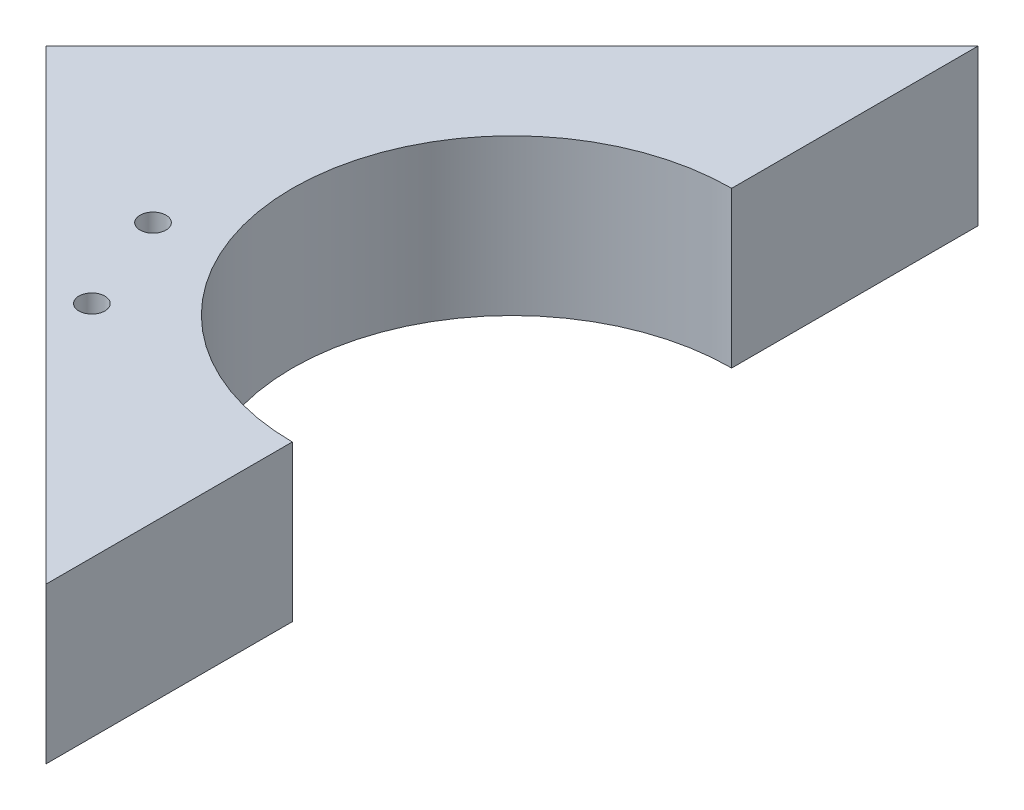
ISO-10303-21;
HEADER;
FILE_DESCRIPTION(('STEP AP214'),'2;1');
FILE_NAME('part.step','',(''),(''),'','','');
FILE_SCHEMA(('AUTOMOTIVE_DESIGN { 1 0 10303 214 1 1 1 1 }'));
ENDSEC;
DATA;
#1=APPLICATION_CONTEXT('core data for automotive mechanical design processes');
#2=APPLICATION_PROTOCOL_DEFINITION('international standard','automotive_design',2000,#1);
#3=PRODUCT_CONTEXT('',#1,'mechanical');
#4=PRODUCT('Part','Part','',(#3));
#5=PRODUCT_RELATED_PRODUCT_CATEGORY('part','',(#4));
#6=PRODUCT_DEFINITION_FORMATION('','',#4);
#7=PRODUCT_DEFINITION_CONTEXT('part definition',#1,'design');
#8=PRODUCT_DEFINITION('design','',#6,#7);
#9=PRODUCT_DEFINITION_SHAPE('','',#8);
#10=(LENGTH_UNIT() NAMED_UNIT(*) SI_UNIT(.MILLI.,.METRE.));
#11=(NAMED_UNIT(*) PLANE_ANGLE_UNIT() SI_UNIT($,.RADIAN.));
#12=(NAMED_UNIT(*) SI_UNIT($,.STERADIAN.) SOLID_ANGLE_UNIT());
#13=UNCERTAINTY_MEASURE_WITH_UNIT(LENGTH_MEASURE(1.E-05),#10,'distance_accuracy_value','');
#14=(GEOMETRIC_REPRESENTATION_CONTEXT(3) GLOBAL_UNCERTAINTY_ASSIGNED_CONTEXT((#13)) GLOBAL_UNIT_ASSIGNED_CONTEXT((#10,
#11,#12)) REPRESENTATION_CONTEXT('',''));
#15=CARTESIAN_POINT('',(0.,0.,0.));
#16=DIRECTION('',(0.,0.,1.));
#17=DIRECTION('',(1.,0.,0.));
#18=AXIS2_PLACEMENT_3D('',#15,#16,#17);
#19=CARTESIAN_POINT('',(0.,36.,-107.76307345283));
#20=DIRECTION('',(0.,1.,0.));
#21=DIRECTION('',(0.,0.,1.));
#22=AXIS2_PLACEMENT_3D('',#19,#20,#21);
#23=PLANE('',#22);
#24=CARTESIAN_POINT('',(-60.0333657227379,36.,-84.782103064267));
#25=DIRECTION('',(0.,1.,0.));
#26=DIRECTION('',(0.,0.,1.));
#27=AXIS2_PLACEMENT_3D('',#24,#25,#26);
#28=CIRCLE('',#27,3.);
#29=CARTESIAN_POINT('',(-60.0333657227379,36.,-81.782103064267));
#30=VERTEX_POINT('',#29);
#31=EDGE_CURVE('E112',#30,#30,#28,.T.);
#32=ORIENTED_EDGE('',*,*,#31,.F.);
#33=EDGE_LOOP('',(#32));
#34=FACE_BOUND('',#33,.T.);
#35=DIRECTION('',(0.,0.,-1.));
#36=VECTOR('',#35,1.);
#37=CARTESIAN_POINT('',(0.,36.,-56.9630734528298));
#38=LINE('',#37,#36);
#39=CARTESIAN_POINT('',(0.,36.,0.));
#40=VERTEX_POINT('',#39);
#41=CARTESIAN_POINT('',(0.,36.,-56.9630734528298));
#42=VERTEX_POINT('',#41);
#43=EDGE_CURVE('E117',#40,#42,#38,.T.);
#44=ORIENTED_EDGE('',*,*,#43,.T.);
#45=CARTESIAN_POINT('',(0.,36.,-107.76307345283));
#46=DIRECTION('',(0.,-1.,0.));
#47=DIRECTION('',(0.,0.,1.));
#48=AXIS2_PLACEMENT_3D('',#45,#46,#47);
#49=CIRCLE('',#48,50.8);
#50=CARTESIAN_POINT('',(0.,36.,-158.56307345283));
#51=VERTEX_POINT('',#50);
#52=EDGE_CURVE('E84',#42,#51,#49,.T.);
#53=ORIENTED_EDGE('',*,*,#52,.T.);
#54=DIRECTION('',(0.,0.,-1.));
#55=VECTOR('',#54,1.);
#56=CARTESIAN_POINT('',(0.,36.,-215.52614690566));
#57=LINE('',#56,#55);
#58=CARTESIAN_POINT('',(0.,36.,-215.52614690566));
#59=VERTEX_POINT('',#58);
#60=EDGE_CURVE('E88',#51,#59,#57,.T.);
#61=ORIENTED_EDGE('',*,*,#60,.T.);
#62=DIRECTION('',(-0.707106781186548,0.,0.707106781186548));
#63=VECTOR('',#62,1.);
#64=CARTESIAN_POINT('',(-107.76307345283,36.,-107.76307345283));
#65=LINE('',#64,#63);
#66=CARTESIAN_POINT('',(-107.76307345283,36.,-107.76307345283));
#67=VERTEX_POINT('',#66);
#68=EDGE_CURVE('E92',#59,#67,#65,.T.);
#69=ORIENTED_EDGE('',*,*,#68,.T.);
#70=DIRECTION('',(0.707106781186547,0.,0.707106781186548));
#71=VECTOR('',#70,1.);
#72=CARTESIAN_POINT('',(0.,36.,0.));
#73=LINE('',#72,#71);
#74=EDGE_CURVE('E50',#67,#40,#73,.T.);
#75=ORIENTED_EDGE('',*,*,#74,.T.);
#76=EDGE_LOOP('',(#44,#53,#61,#69,#75));
#77=FACE_BOUND('',#76,.T.);
#78=CARTESIAN_POINT('',(-50.9025817885837,36.,-61.5091835063819));
#79=DIRECTION('',(0.,1.,0.));
#80=DIRECTION('',(0.,0.,1.));
#81=AXIS2_PLACEMENT_3D('',#78,#79,#80);
#82=CIRCLE('',#81,3.);
#83=CARTESIAN_POINT('',(-50.9025817885837,36.,-58.5091835063819));
#84=VERTEX_POINT('',#83);
#85=EDGE_CURVE('E155',#84,#84,#82,.T.);
#86=ORIENTED_EDGE('',*,*,#85,.F.);
#87=EDGE_LOOP('',(#86));
#88=FACE_BOUND('',#87,.T.);
#89=ADVANCED_FACE('F33',(#34,#77,#88),#23,.T.);
#90=CARTESIAN_POINT('',(0.,0.,-107.76307345283));
#91=DIRECTION('',(0.,1.,0.));
#92=DIRECTION('',(0.,0.,1.));
#93=AXIS2_PLACEMENT_3D('',#90,#91,#92);
#94=PLANE('',#93);
#95=CARTESIAN_POINT('',(-60.0333657227379,0.,-84.782103064267));
#96=DIRECTION('',(0.,1.,0.));
#97=DIRECTION('',(0.,0.,1.));
#98=AXIS2_PLACEMENT_3D('',#95,#96,#97);
#99=CIRCLE('',#98,3.);
#100=CARTESIAN_POINT('',(-60.0333657227379,0.,-81.782103064267));
#101=VERTEX_POINT('',#100);
#102=EDGE_CURVE('E160',#101,#101,#99,.T.);
#103=ORIENTED_EDGE('',*,*,#102,.T.);
#104=EDGE_LOOP('',(#103));
#105=FACE_BOUND('',#104,.T.);
#106=DIRECTION('',(0.,0.,-1.));
#107=VECTOR('',#106,1.);
#108=CARTESIAN_POINT('',(0.,0.,-56.9630734528298));
#109=LINE('',#108,#107);
#110=CARTESIAN_POINT('',(0.,0.,0.));
#111=VERTEX_POINT('',#110);
#112=CARTESIAN_POINT('',(0.,0.,-56.9630734528298));
#113=VERTEX_POINT('',#112);
#114=EDGE_CURVE('E108',#111,#113,#109,.T.);
#115=ORIENTED_EDGE('',*,*,#114,.F.);
#116=DIRECTION('',(0.707106781186547,0.,0.707106781186548));
#117=VECTOR('',#116,1.);
#118=CARTESIAN_POINT('',(0.,0.,0.));
#119=LINE('',#118,#117);
#120=CARTESIAN_POINT('',(-107.76307345283,0.,-107.76307345283));
#121=VERTEX_POINT('',#120);
#122=EDGE_CURVE('E76',#121,#111,#119,.T.);
#123=ORIENTED_EDGE('',*,*,#122,.F.);
#124=DIRECTION('',(-0.707106781186548,0.,0.707106781186548));
#125=VECTOR('',#124,1.);
#126=CARTESIAN_POINT('',(-107.76307345283,0.,-107.76307345283));
#127=LINE('',#126,#125);
#128=CARTESIAN_POINT('',(0.,0.,-215.52614690566));
#129=VERTEX_POINT('',#128);
#130=EDGE_CURVE('E70',#129,#121,#127,.T.);
#131=ORIENTED_EDGE('',*,*,#130,.F.);
#132=DIRECTION('',(0.,0.,-1.));
#133=VECTOR('',#132,1.);
#134=CARTESIAN_POINT('',(0.,0.,-215.52614690566));
#135=LINE('',#134,#133);
#136=CARTESIAN_POINT('',(0.,0.,-158.56307345283));
#137=VERTEX_POINT('',#136);
#138=EDGE_CURVE('E99',#137,#129,#135,.T.);
#139=ORIENTED_EDGE('',*,*,#138,.F.);
#140=CARTESIAN_POINT('',(0.,0.,-107.76307345283));
#141=DIRECTION('',(0.,-1.,0.));
#142=DIRECTION('',(0.,0.,1.));
#143=AXIS2_PLACEMENT_3D('',#140,#141,#142);
#144=CIRCLE('',#143,50.8);
#145=EDGE_CURVE('E111',#113,#137,#144,.T.);
#146=ORIENTED_EDGE('',*,*,#145,.F.);
#147=EDGE_LOOP('',(#115,#123,#131,#139,#146));
#148=FACE_BOUND('',#147,.T.);
#149=CARTESIAN_POINT('',(-50.9025817885837,0.,-61.5091835063819));
#150=DIRECTION('',(0.,1.,0.));
#151=DIRECTION('',(0.,0.,1.));
#152=AXIS2_PLACEMENT_3D('',#149,#150,#151);
#153=CIRCLE('',#152,3.);
#154=CARTESIAN_POINT('',(-50.9025817885837,0.,-58.5091835063819));
#155=VERTEX_POINT('',#154);
#156=EDGE_CURVE('E158',#155,#155,#153,.T.);
#157=ORIENTED_EDGE('',*,*,#156,.T.);
#158=EDGE_LOOP('',(#157));
#159=FACE_BOUND('',#158,.T.);
#160=ADVANCED_FACE('F121',(#105,#148,#159),#94,.F.);
#161=CARTESIAN_POINT('',(0.,36.,-56.9630734528298));
#162=DIRECTION('',(-1.,0.,0.));
#163=DIRECTION('',(0.,0.,1.));
#164=AXIS2_PLACEMENT_3D('',#161,#162,#163);
#165=PLANE('',#164);
#166=ORIENTED_EDGE('',*,*,#114,.T.);
#167=DIRECTION('',(0.,-1.,0.));
#168=VECTOR('',#167,1.);
#169=CARTESIAN_POINT('',(0.,36.,-56.9630734528298));
#170=LINE('',#169,#168);
#171=EDGE_CURVE('E11',#42,#113,#170,.T.);
#172=ORIENTED_EDGE('',*,*,#171,.F.);
#173=ORIENTED_EDGE('',*,*,#43,.F.);
#174=DIRECTION('',(0.,-1.,0.));
#175=VECTOR('',#174,1.);
#176=CARTESIAN_POINT('',(0.,36.,0.));
#177=LINE('',#176,#175);
#178=EDGE_CURVE('E104',#40,#111,#177,.T.);
#179=ORIENTED_EDGE('',*,*,#178,.T.);
#180=EDGE_LOOP('',(#166,#172,#173,#179));
#181=FACE_BOUND('',#180,.T.);
#182=ADVANCED_FACE('F35',(#181),#165,.F.);
#183=CARTESIAN_POINT('',(0.,36.,-107.76307345283));
#184=DIRECTION('',(0.,-1.,0.));
#185=DIRECTION('',(0.,0.,-1.));
#186=AXIS2_PLACEMENT_3D('',#183,#184,#185);
#187=CYLINDRICAL_SURFACE('',#186,50.8);
#188=ORIENTED_EDGE('',*,*,#145,.T.);
#189=DIRECTION('',(0.,-1.,0.));
#190=VECTOR('',#189,1.);
#191=CARTESIAN_POINT('',(0.,36.,-158.56307345283));
#192=LINE('',#191,#190);
#193=EDGE_CURVE('E42',#51,#137,#192,.T.);
#194=ORIENTED_EDGE('',*,*,#193,.F.);
#195=ORIENTED_EDGE('',*,*,#52,.F.);
#196=ORIENTED_EDGE('',*,*,#171,.T.);
#197=EDGE_LOOP('',(#188,#194,#195,#196));
#198=FACE_BOUND('',#197,.T.);
#199=ADVANCED_FACE('F192',(#198),#187,.F.);
#200=CARTESIAN_POINT('',(0.,36.,-215.52614690566));
#201=DIRECTION('',(-1.,0.,0.));
#202=DIRECTION('',(0.,0.,1.));
#203=AXIS2_PLACEMENT_3D('',#200,#201,#202);
#204=PLANE('',#203);
#205=ORIENTED_EDGE('',*,*,#138,.T.);
#206=DIRECTION('',(0.,-1.,0.));
#207=VECTOR('',#206,1.);
#208=CARTESIAN_POINT('',(0.,36.,-215.52614690566));
#209=LINE('',#208,#207);
#210=EDGE_CURVE('E96',#59,#129,#209,.T.);
#211=ORIENTED_EDGE('',*,*,#210,.F.);
#212=ORIENTED_EDGE('',*,*,#60,.F.);
#213=ORIENTED_EDGE('',*,*,#193,.T.);
#214=EDGE_LOOP('',(#205,#211,#212,#213));
#215=FACE_BOUND('',#214,.T.);
#216=ADVANCED_FACE('F97',(#215),#204,.F.);
#217=CARTESIAN_POINT('',(-107.76307345283,36.,-107.76307345283));
#218=DIRECTION('',(0.707106781186548,0.,0.707106781186547));
#219=DIRECTION('',(0.707106781186547,0.,-0.707106781186548));
#220=AXIS2_PLACEMENT_3D('',#217,#218,#219);
#221=PLANE('',#220);
#222=ORIENTED_EDGE('',*,*,#130,.T.);
#223=DIRECTION('',(0.,-1.,0.));
#224=VECTOR('',#223,1.);
#225=CARTESIAN_POINT('',(-107.76307345283,36.,-107.76307345283));
#226=LINE('',#225,#224);
#227=EDGE_CURVE('E100',#67,#121,#226,.T.);
#228=ORIENTED_EDGE('',*,*,#227,.F.);
#229=ORIENTED_EDGE('',*,*,#68,.F.);
#230=ORIENTED_EDGE('',*,*,#210,.T.);
#231=EDGE_LOOP('',(#222,#228,#229,#230));
#232=FACE_BOUND('',#231,.T.);
#233=ADVANCED_FACE('F102',(#232),#221,.F.);
#234=CARTESIAN_POINT('',(0.,36.,0.));
#235=DIRECTION('',(0.707106781186548,0.,-0.707106781186547));
#236=DIRECTION('',(-0.707106781186547,0.,-0.707106781186548));
#237=AXIS2_PLACEMENT_3D('',#234,#235,#236);
#238=PLANE('',#237);
#239=ORIENTED_EDGE('',*,*,#122,.T.);
#240=ORIENTED_EDGE('',*,*,#178,.F.);
#241=ORIENTED_EDGE('',*,*,#74,.F.);
#242=ORIENTED_EDGE('',*,*,#227,.T.);
#243=EDGE_LOOP('',(#239,#240,#241,#242));
#244=FACE_BOUND('',#243,.T.);
#245=ADVANCED_FACE('F126',(#244),#238,.F.);
#246=CARTESIAN_POINT('',(-60.0333657227379,36.,-84.782103064267));
#247=DIRECTION('',(0.,-1.,0.));
#248=DIRECTION('',(0.,0.,-1.));
#249=AXIS2_PLACEMENT_3D('',#246,#247,#248);
#250=CYLINDRICAL_SURFACE('',#249,3.);
#251=ORIENTED_EDGE('',*,*,#31,.T.);
#252=EDGE_LOOP('',(#251));
#253=FACE_BOUND('',#252,.T.);
#254=ORIENTED_EDGE('',*,*,#102,.F.);
#255=EDGE_LOOP('',(#254));
#256=FACE_BOUND('',#255,.T.);
#257=ADVANCED_FACE('F128',(#253,#256),#250,.F.);
#258=CARTESIAN_POINT('',(-50.9025817885837,36.,-61.5091835063819));
#259=DIRECTION('',(0.,-1.,0.));
#260=DIRECTION('',(0.,0.,-1.));
#261=AXIS2_PLACEMENT_3D('',#258,#259,#260);
#262=CYLINDRICAL_SURFACE('',#261,3.);
#263=ORIENTED_EDGE('',*,*,#85,.T.);
#264=EDGE_LOOP('',(#263));
#265=FACE_BOUND('',#264,.T.);
#266=ORIENTED_EDGE('',*,*,#156,.F.);
#267=EDGE_LOOP('',(#266));
#268=FACE_BOUND('',#267,.T.);
#269=ADVANCED_FACE('F134',(#265,#268),#262,.F.);
#270=CLOSED_SHELL('',(#89,#160,#182,#199,#216,#233,#245,#257,#269));
#271=MANIFOLD_SOLID_BREP('B2',#270);
#272=ADVANCED_BREP_SHAPE_REPRESENTATION('',(#18,#271),#14);
#273=SHAPE_DEFINITION_REPRESENTATION(#9,#272);
ENDSEC;
END-ISO-10303-21;
